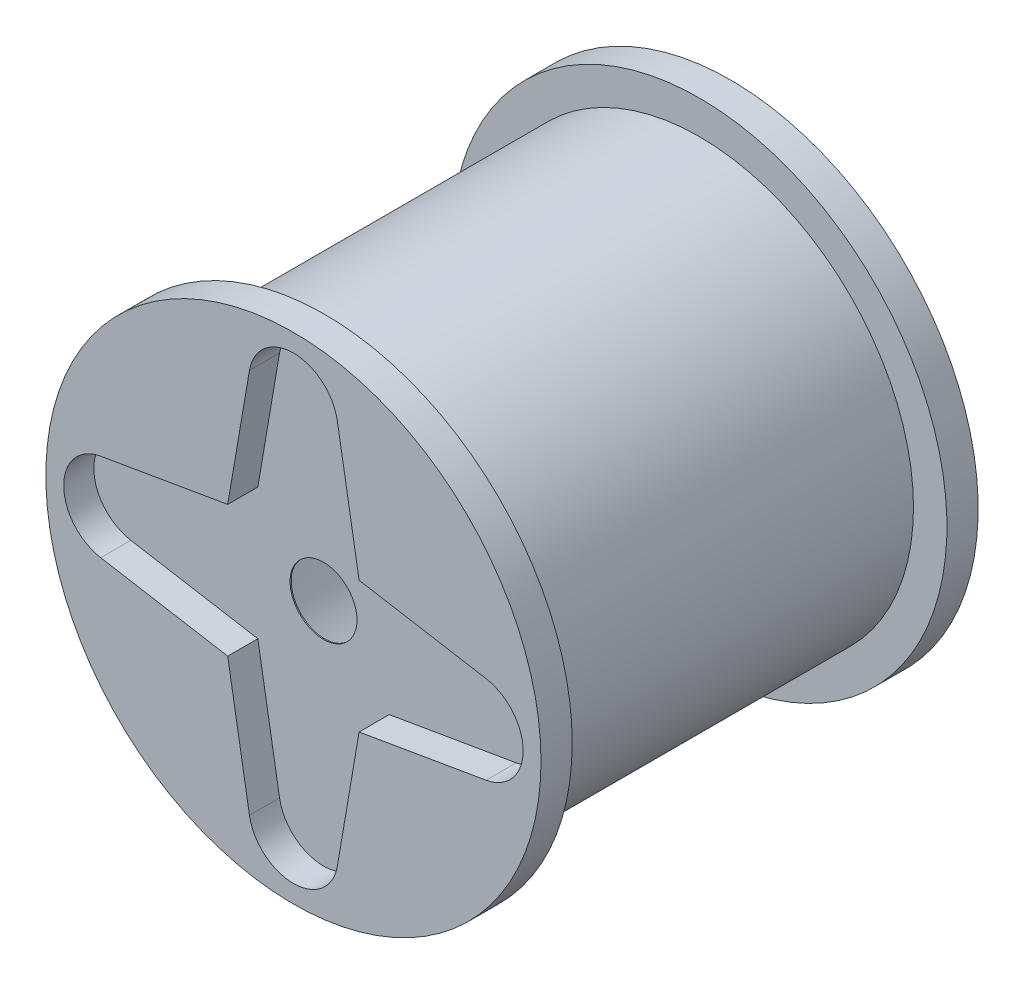
ISO-10303-21;
HEADER;
FILE_DESCRIPTION(('STEP AP214'),'2;1');
FILE_NAME('part.step','',(''),(''),'','','');
FILE_SCHEMA(('AUTOMOTIVE_DESIGN { 1 0 10303 214 1 1 1 1 }'));
ENDSEC;
DATA;
#1=APPLICATION_CONTEXT('core data for automotive mechanical design processes');
#2=APPLICATION_PROTOCOL_DEFINITION('international standard','automotive_design',2000,#1);
#3=PRODUCT_CONTEXT('',#1,'mechanical');
#4=PRODUCT('Part','Part','',(#3));
#5=PRODUCT_RELATED_PRODUCT_CATEGORY('part','',(#4));
#6=PRODUCT_DEFINITION_FORMATION('','',#4);
#7=PRODUCT_DEFINITION_CONTEXT('part definition',#1,'design');
#8=PRODUCT_DEFINITION('design','',#6,#7);
#9=PRODUCT_DEFINITION_SHAPE('','',#8);
#10=(LENGTH_UNIT() NAMED_UNIT(*) SI_UNIT(.MILLI.,.METRE.));
#11=(NAMED_UNIT(*) PLANE_ANGLE_UNIT() SI_UNIT($,.RADIAN.));
#12=(NAMED_UNIT(*) SI_UNIT($,.STERADIAN.) SOLID_ANGLE_UNIT());
#13=UNCERTAINTY_MEASURE_WITH_UNIT(LENGTH_MEASURE(1.E-05),#10,'distance_accuracy_value','');
#14=(GEOMETRIC_REPRESENTATION_CONTEXT(3) GLOBAL_UNCERTAINTY_ASSIGNED_CONTEXT((#13)) GLOBAL_UNIT_ASSIGNED_CONTEXT((#10,
#11,#12)) REPRESENTATION_CONTEXT('',''));
#15=CARTESIAN_POINT('',(0.,0.,0.));
#16=DIRECTION('',(0.,0.,1.));
#17=DIRECTION('',(1.,0.,0.));
#18=AXIS2_PLACEMENT_3D('',#15,#16,#17);
#19=CARTESIAN_POINT('',(3.35128403147245,0.573493975903614,8.45));
#20=DIRECTION('',(0.985671773962487,0.168674698795181,0.));
#21=DIRECTION('',(-0.168674698795181,0.985671773962487,0.));
#22=AXIS2_PLACEMENT_3D('',#19,#20,#21);
#23=PLANE('',#22);
#24=DIRECTION('',(0.,0.,-1.));
#25=VECTOR('',#24,1.);
#26=CARTESIAN_POINT('',(2.94538951713309,2.94538951713312,8.45));
#27=LINE('',#26,#25);
#28=CARTESIAN_POINT('',(2.94538951713309,2.94538951713312,9.8));
#29=VERTEX_POINT('',#28);
#30=CARTESIAN_POINT('',(2.94538951713309,2.94538951713312,8.45));
#31=VERTEX_POINT('',#30);
#32=EDGE_CURVE('E213',#29,#31,#27,.T.);
#33=ORIENTED_EDGE('',*,*,#32,.F.);
#34=DIRECTION('',(-0.168674698795181,0.985671773962487,0.));
#35=VECTOR('',#34,1.);
#36=CARTESIAN_POINT('',(3.35128403147245,0.573493975903614,9.8));
#37=LINE('',#36,#35);
#38=CARTESIAN_POINT('',(1.97134354792497,8.63734939759036,9.8));
#39=VERTEX_POINT('',#38);
#40=EDGE_CURVE('E50',#29,#39,#37,.T.);
#41=ORIENTED_EDGE('',*,*,#40,.T.);
#42=DIRECTION('',(0.,0.,1.));
#43=VECTOR('',#42,1.);
#44=CARTESIAN_POINT('',(1.97134354792497,8.63734939759036,8.45));
#45=LINE('',#44,#43);
#46=CARTESIAN_POINT('',(1.97134354792497,8.63734939759036,8.45));
#47=VERTEX_POINT('',#46);
#48=EDGE_CURVE('E225',#47,#39,#45,.T.);
#49=ORIENTED_EDGE('',*,*,#48,.F.);
#50=DIRECTION('',(-0.168674698795181,0.985671773962487,0.));
#51=VECTOR('',#50,1.);
#52=CARTESIAN_POINT('',(3.35128403147245,0.573493975903614,8.45));
#53=LINE('',#52,#51);
#54=EDGE_CURVE('E219',#31,#47,#53,.T.);
#55=ORIENTED_EDGE('',*,*,#54,.F.);
#56=EDGE_LOOP('',(#33,#41,#49,#55));
#57=FACE_BOUND('',#56,.T.);
#58=ADVANCED_FACE('F33',(#57),#23,.F.);
#59=CARTESIAN_POINT('',(0.,0.,-9.8));
#60=DIRECTION('',(0.,0.,1.));
#61=DIRECTION('',(1.,0.,0.));
#62=AXIS2_PLACEMENT_3D('',#59,#60,#61);
#63=CYLINDRICAL_SURFACE('',#62,9.6);
#64=CARTESIAN_POINT('',(0.,0.,8.4));
#65=DIRECTION('',(0.,0.,1.));
#66=DIRECTION('',(1.,0.,0.));
#67=AXIS2_PLACEMENT_3D('',#64,#65,#66);
#68=CIRCLE('',#67,9.6);
#69=CARTESIAN_POINT('',(9.6,0.,8.4));
#70=VERTEX_POINT('',#69);
#71=EDGE_CURVE('E11',#70,#70,#68,.F.);
#72=ORIENTED_EDGE('',*,*,#71,.T.);
#73=EDGE_LOOP('',(#72));
#74=FACE_BOUND('',#73,.T.);
#75=CARTESIAN_POINT('',(0.,0.,-8.4));
#76=DIRECTION('',(0.,0.,-1.));
#77=DIRECTION('',(-1.,0.,0.));
#78=AXIS2_PLACEMENT_3D('',#75,#76,#77);
#79=CIRCLE('',#78,9.6);
#80=CARTESIAN_POINT('',(-9.6,0.,-8.4));
#81=VERTEX_POINT('',#80);
#82=EDGE_CURVE('E238',#81,#81,#79,.F.);
#83=ORIENTED_EDGE('',*,*,#82,.T.);
#84=EDGE_LOOP('',(#83));
#85=FACE_BOUND('',#84,.T.);
#86=ADVANCED_FACE('F35',(#74,#85),#63,.T.);
#87=CARTESIAN_POINT('',(0.,0.,8.4));
#88=DIRECTION('',(0.,0.,1.));
#89=DIRECTION('',(1.,0.,0.));
#90=AXIS2_PLACEMENT_3D('',#87,#88,#89);
#91=CYLINDRICAL_SURFACE('',#90,11.1);
#92=CARTESIAN_POINT('',(0.,0.,8.4));
#93=DIRECTION('',(0.,0.,1.));
#94=DIRECTION('',(1.,0.,0.));
#95=AXIS2_PLACEMENT_3D('',#92,#93,#94);
#96=CIRCLE('',#95,11.1);
#97=CARTESIAN_POINT('',(11.1,0.,8.4));
#98=VERTEX_POINT('',#97);
#99=EDGE_CURVE('E42',#98,#98,#96,.T.);
#100=ORIENTED_EDGE('',*,*,#99,.T.);
#101=EDGE_LOOP('',(#100));
#102=FACE_BOUND('',#101,.T.);
#103=CARTESIAN_POINT('',(0.,0.,9.8));
#104=DIRECTION('',(0.,0.,1.));
#105=DIRECTION('',(1.,0.,0.));
#106=AXIS2_PLACEMENT_3D('',#103,#104,#105);
#107=CIRCLE('',#106,11.1);
#108=CARTESIAN_POINT('',(11.1,0.,9.8));
#109=VERTEX_POINT('',#108);
#110=EDGE_CURVE('E243',#109,#109,#107,.T.);
#111=ORIENTED_EDGE('',*,*,#110,.F.);
#112=EDGE_LOOP('',(#111));
#113=FACE_BOUND('',#112,.T.);
#114=ADVANCED_FACE('F278',(#102,#113),#91,.T.);
#115=CARTESIAN_POINT('',(0.,0.,8.4));
#116=DIRECTION('',(0.,0.,1.));
#117=DIRECTION('',(1.,0.,0.));
#118=AXIS2_PLACEMENT_3D('',#115,#116,#117);
#119=PLANE('',#118);
#120=ORIENTED_EDGE('',*,*,#71,.F.);
#121=EDGE_LOOP('',(#120));
#122=FACE_BOUND('',#121,.T.);
#123=ORIENTED_EDGE('',*,*,#99,.F.);
#124=EDGE_LOOP('',(#123));
#125=FACE_BOUND('',#124,.T.);
#126=ADVANCED_FACE('F282',(#122,#125),#119,.F.);
#127=CARTESIAN_POINT('',(0.,0.,9.8));
#128=DIRECTION('',(0.,0.,1.));
#129=DIRECTION('',(1.,0.,0.));
#130=AXIS2_PLACEMENT_3D('',#127,#128,#129);
#131=PLANE('',#130);
#132=DIRECTION('',(-0.985671773962486,-0.168674698795184,0.));
#133=VECTOR('',#132,1.);
#134=CARTESIAN_POINT('',(-0.573493975903626,3.35128403147245,9.8));
#135=LINE('',#134,#133);
#136=CARTESIAN_POINT('',(-2.9453895171331,2.94538951713309,9.8));
#137=VERTEX_POINT('',#136);
#138=CARTESIAN_POINT('',(-8.63734939759037,1.97134354792494,9.8));
#139=VERTEX_POINT('',#138);
#140=EDGE_CURVE('E196',#137,#139,#135,.T.);
#141=ORIENTED_EDGE('',*,*,#140,.F.);
#142=DIRECTION('',(0.168674698795181,0.985671773962487,0.));
#143=VECTOR('',#142,1.);
#144=CARTESIAN_POINT('',(-3.35128403147245,0.573493975903614,9.8));
#145=LINE('',#144,#143);
#146=CARTESIAN_POINT('',(-1.97134354792497,8.63734939759036,9.8));
#147=VERTEX_POINT('',#146);
#148=EDGE_CURVE('E71',#137,#147,#145,.T.);
#149=ORIENTED_EDGE('',*,*,#148,.T.);
#150=CARTESIAN_POINT('',(0.,8.3,9.8));
#151=DIRECTION('',(0.,0.,1.));
#152=DIRECTION('',(1.,0.,0.));
#153=AXIS2_PLACEMENT_3D('',#150,#151,#152);
#154=CIRCLE('',#153,2.);
#155=EDGE_CURVE('E227',#39,#147,#154,.T.);
#156=ORIENTED_EDGE('',*,*,#155,.F.);
#157=ORIENTED_EDGE('',*,*,#40,.F.);
#158=DIRECTION('',(0.985671773962488,-0.16867469879517,0.));
#159=VECTOR('',#158,1.);
#160=CARTESIAN_POINT('',(0.573493975903579,3.35128403147246,9.8));
#161=LINE('',#160,#159);
#162=CARTESIAN_POINT('',(8.63734939759034,1.97134354792506,9.8));
#163=VERTEX_POINT('',#162);
#164=EDGE_CURVE('E147',#29,#163,#161,.T.);
#165=ORIENTED_EDGE('',*,*,#164,.T.);
#166=CARTESIAN_POINT('',(8.3,0.,9.8));
#167=DIRECTION('',(0.,0.,1.));
#168=DIRECTION('',(0.,-1.,0.));
#169=AXIS2_PLACEMENT_3D('',#166,#167,#168);
#170=CIRCLE('',#169,2.);
#171=CARTESIAN_POINT('',(8.63734939759038,-1.97134354792488,9.8));
#172=VERTEX_POINT('',#171);
#173=EDGE_CURVE('E167',#172,#163,#170,.T.);
#174=ORIENTED_EDGE('',*,*,#173,.F.);
#175=DIRECTION('',(0.985671773962485,0.168674698795191,0.));
#176=VECTOR('',#175,1.);
#177=CARTESIAN_POINT('',(0.573493975903649,-3.35128403147245,9.8));
#178=LINE('',#177,#176);
#179=CARTESIAN_POINT('',(2.9453895171331,-2.94538951713307,9.8));
#180=VERTEX_POINT('',#179);
#181=EDGE_CURVE('E153',#180,#172,#178,.T.);
#182=ORIENTED_EDGE('',*,*,#181,.F.);
#183=DIRECTION('',(-0.168674698795181,-0.985671773962487,0.));
#184=VECTOR('',#183,1.);
#185=CARTESIAN_POINT('',(3.35128403147245,-0.573493975903614,9.8));
#186=LINE('',#185,#184);
#187=CARTESIAN_POINT('',(1.97134354792497,-8.63734939759036,9.8));
#188=VERTEX_POINT('',#187);
#189=EDGE_CURVE('E179',#180,#188,#186,.T.);
#190=ORIENTED_EDGE('',*,*,#189,.T.);
#191=CARTESIAN_POINT('',(0.,-8.3,9.8));
#192=DIRECTION('',(0.,0.,1.));
#193=DIRECTION('',(-1.,0.,0.));
#194=AXIS2_PLACEMENT_3D('',#191,#192,#193);
#195=CIRCLE('',#194,2.);
#196=CARTESIAN_POINT('',(-1.97134354792497,-8.63734939759036,9.8));
#197=VERTEX_POINT('',#196);
#198=EDGE_CURVE('E184',#197,#188,#195,.T.);
#199=ORIENTED_EDGE('',*,*,#198,.F.);
#200=DIRECTION('',(0.168674698795181,-0.985671773962487,0.));
#201=VECTOR('',#200,1.);
#202=CARTESIAN_POINT('',(-3.35128403147245,-0.573493975903614,9.8));
#203=LINE('',#202,#201);
#204=CARTESIAN_POINT('',(-2.9453895171331,-2.94538951713311,9.8));
#205=VERTEX_POINT('',#204);
#206=EDGE_CURVE('E175',#205,#197,#203,.T.);
#207=ORIENTED_EDGE('',*,*,#206,.F.);
#208=DIRECTION('',(-0.985671773962487,0.168674698795177,0.));
#209=VECTOR('',#208,1.);
#210=CARTESIAN_POINT('',(-0.573493975903602,-3.35128403147246,9.8));
#211=LINE('',#210,#209);
#212=CARTESIAN_POINT('',(-8.63734939759035,-1.971343547925,9.8));
#213=VERTEX_POINT('',#212);
#214=EDGE_CURVE('E199',#205,#213,#211,.T.);
#215=ORIENTED_EDGE('',*,*,#214,.T.);
#216=CARTESIAN_POINT('',(-8.3,0.,9.8));
#217=DIRECTION('',(0.,0.,1.));
#218=DIRECTION('',(0.,1.,0.));
#219=AXIS2_PLACEMENT_3D('',#216,#217,#218);
#220=CIRCLE('',#219,2.);
#221=EDGE_CURVE('E206',#139,#213,#220,.T.);
#222=ORIENTED_EDGE('',*,*,#221,.F.);
#223=EDGE_LOOP('',(#141,#149,#156,#157,#165,#174,#182,#190,#199,#207,#215,#222));
#224=FACE_BOUND('',#223,.T.);
#225=ORIENTED_EDGE('',*,*,#110,.T.);
#226=EDGE_LOOP('',(#225));
#227=FACE_BOUND('',#226,.T.);
#228=ADVANCED_FACE('F259',(#224,#227),#131,.T.);
#229=CARTESIAN_POINT('',(0.,0.,-8.4));
#230=DIRECTION('',(0.,0.,-1.));
#231=DIRECTION('',(-1.,0.,0.));
#232=AXIS2_PLACEMENT_3D('',#229,#230,#231);
#233=CYLINDRICAL_SURFACE('',#232,11.1);
#234=CARTESIAN_POINT('',(0.,0.,-8.4));
#235=DIRECTION('',(0.,0.,-1.));
#236=DIRECTION('',(-1.,0.,0.));
#237=AXIS2_PLACEMENT_3D('',#234,#235,#236);
#238=CIRCLE('',#237,11.1);
#239=CARTESIAN_POINT('',(-11.1,0.,-8.4));
#240=VERTEX_POINT('',#239);
#241=EDGE_CURVE('E235',#240,#240,#238,.T.);
#242=ORIENTED_EDGE('',*,*,#241,.T.);
#243=EDGE_LOOP('',(#242));
#244=FACE_BOUND('',#243,.T.);
#245=CARTESIAN_POINT('',(0.,0.,-9.8));
#246=DIRECTION('',(0.,0.,-1.));
#247=DIRECTION('',(-1.,0.,0.));
#248=AXIS2_PLACEMENT_3D('',#245,#246,#247);
#249=CIRCLE('',#248,11.1);
#250=CARTESIAN_POINT('',(-11.1,0.,-9.8));
#251=VERTEX_POINT('',#250);
#252=EDGE_CURVE('E233',#251,#251,#249,.T.);
#253=ORIENTED_EDGE('',*,*,#252,.F.);
#254=EDGE_LOOP('',(#253));
#255=FACE_BOUND('',#254,.T.);
#256=ADVANCED_FACE('F253',(#244,#255),#233,.T.);
#257=CARTESIAN_POINT('',(0.,0.,-8.4));
#258=DIRECTION('',(0.,0.,-1.));
#259=DIRECTION('',(-1.,0.,0.));
#260=AXIS2_PLACEMENT_3D('',#257,#258,#259);
#261=PLANE('',#260);
#262=ORIENTED_EDGE('',*,*,#82,.F.);
#263=EDGE_LOOP('',(#262));
#264=FACE_BOUND('',#263,.T.);
#265=ORIENTED_EDGE('',*,*,#241,.F.);
#266=EDGE_LOOP('',(#265));
#267=FACE_BOUND('',#266,.T.);
#268=ADVANCED_FACE('F249',(#264,#267),#261,.F.);
#269=CARTESIAN_POINT('',(0.,0.,-9.8));
#270=DIRECTION('',(0.,0.,1.));
#271=DIRECTION('',(1.,0.,0.));
#272=AXIS2_PLACEMENT_3D('',#269,#270,#271);
#273=PLANE('',#272);
#274=CARTESIAN_POINT('',(0.,0.,-9.8));
#275=DIRECTION('',(0.,0.,-1.));
#276=DIRECTION('',(-1.,0.,0.));
#277=AXIS2_PLACEMENT_3D('',#274,#275,#276);
#278=CIRCLE('',#277,8.);
#279=CARTESIAN_POINT('',(-8.,0.,-9.8));
#280=VERTEX_POINT('',#279);
#281=EDGE_CURVE('E168',#280,#280,#278,.T.);
#282=ORIENTED_EDGE('',*,*,#281,.F.);
#283=EDGE_LOOP('',(#282));
#284=FACE_BOUND('',#283,.T.);
#285=ORIENTED_EDGE('',*,*,#252,.T.);
#286=EDGE_LOOP('',(#285));
#287=FACE_BOUND('',#286,.T.);
#288=ADVANCED_FACE('F252',(#284,#287),#273,.F.);
#289=CARTESIAN_POINT('',(-3.35128403147245,0.573493975903614,8.45));
#290=DIRECTION('',(0.985671773962487,-0.168674698795181,0.));
#291=DIRECTION('',(0.168674698795181,0.985671773962487,0.));
#292=AXIS2_PLACEMENT_3D('',#289,#290,#291);
#293=PLANE('',#292);
#294=DIRECTION('',(0.,0.,1.));
#295=VECTOR('',#294,1.);
#296=CARTESIAN_POINT('',(-2.9453895171331,2.94538951713309,8.45));
#297=LINE('',#296,#295);
#298=CARTESIAN_POINT('',(-2.9453895171331,2.94538951713309,8.45));
#299=VERTEX_POINT('',#298);
#300=EDGE_CURVE('E217',#299,#137,#297,.T.);
#301=ORIENTED_EDGE('',*,*,#300,.F.);
#302=DIRECTION('',(0.168674698795181,0.985671773962487,0.));
#303=VECTOR('',#302,1.);
#304=CARTESIAN_POINT('',(-3.35128403147245,0.573493975903614,8.45));
#305=LINE('',#304,#303);
#306=CARTESIAN_POINT('',(-1.97134354792497,8.63734939759036,8.45));
#307=VERTEX_POINT('',#306);
#308=EDGE_CURVE('E59',#299,#307,#305,.T.);
#309=ORIENTED_EDGE('',*,*,#308,.T.);
#310=DIRECTION('',(0.,0.,1.));
#311=VECTOR('',#310,1.);
#312=CARTESIAN_POINT('',(-1.97134354792497,8.63734939759036,8.45));
#313=LINE('',#312,#311);
#314=EDGE_CURVE('E231',#307,#147,#313,.T.);
#315=ORIENTED_EDGE('',*,*,#314,.T.);
#316=ORIENTED_EDGE('',*,*,#148,.F.);
#317=EDGE_LOOP('',(#301,#309,#315,#316));
#318=FACE_BOUND('',#317,.T.);
#319=ADVANCED_FACE('F264',(#318),#293,.T.);
#320=CARTESIAN_POINT('',(0.,8.3,8.45));
#321=DIRECTION('',(0.,0.,1.));
#322=DIRECTION('',(1.,0.,0.));
#323=AXIS2_PLACEMENT_3D('',#320,#321,#322);
#324=CYLINDRICAL_SURFACE('',#323,2.);
#325=ORIENTED_EDGE('',*,*,#155,.T.);
#326=ORIENTED_EDGE('',*,*,#314,.F.);
#327=CARTESIAN_POINT('',(0.,8.3,8.45));
#328=DIRECTION('',(0.,0.,1.));
#329=DIRECTION('',(1.,0.,0.));
#330=AXIS2_PLACEMENT_3D('',#327,#328,#329);
#331=CIRCLE('',#330,2.);
#332=EDGE_CURVE('E221',#47,#307,#331,.T.);
#333=ORIENTED_EDGE('',*,*,#332,.F.);
#334=ORIENTED_EDGE('',*,*,#48,.T.);
#335=EDGE_LOOP('',(#325,#326,#333,#334));
#336=FACE_BOUND('',#335,.T.);
#337=ADVANCED_FACE('F269',(#336),#324,.F.);
#338=CARTESIAN_POINT('',(0.,0.,8.45));
#339=DIRECTION('',(0.,0.,1.));
#340=DIRECTION('',(1.,0.,0.));
#341=AXIS2_PLACEMENT_3D('',#338,#339,#340);
#342=PLANE('',#341);
#343=CARTESIAN_POINT('',(0.,0.,8.45));
#344=DIRECTION('',(0.,0.,1.));
#345=DIRECTION('',(1.,0.,0.));
#346=AXIS2_PLACEMENT_3D('',#343,#344,#345);
#347=CIRCLE('',#346,1.5);
#348=CARTESIAN_POINT('',(1.5,0.,8.45));
#349=VERTEX_POINT('',#348);
#350=EDGE_CURVE('E346',#349,#349,#347,.T.);
#351=ORIENTED_EDGE('',*,*,#350,.F.);
#352=EDGE_LOOP('',(#351));
#353=FACE_BOUND('',#352,.T.);
#354=DIRECTION('',(0.985671773962488,-0.16867469879517,0.));
#355=VECTOR('',#354,1.);
#356=CARTESIAN_POINT('',(0.573493975903579,3.35128403147246,8.45));
#357=LINE('',#356,#355);
#358=CARTESIAN_POINT('',(8.63734939759034,1.97134354792506,8.45));
#359=VERTEX_POINT('',#358);
#360=EDGE_CURVE('E158',#31,#359,#357,.T.);
#361=ORIENTED_EDGE('',*,*,#360,.F.);
#362=ORIENTED_EDGE('',*,*,#54,.T.);
#363=ORIENTED_EDGE('',*,*,#332,.T.);
#364=ORIENTED_EDGE('',*,*,#308,.F.);
#365=DIRECTION('',(-0.985671773962486,-0.168674698795184,0.));
#366=VECTOR('',#365,1.);
#367=CARTESIAN_POINT('',(-0.573493975903626,3.35128403147245,8.45));
#368=LINE('',#367,#366);
#369=CARTESIAN_POINT('',(-8.63734939759037,1.97134354792494,8.45));
#370=VERTEX_POINT('',#369);
#371=EDGE_CURVE('E78',#299,#370,#368,.T.);
#372=ORIENTED_EDGE('',*,*,#371,.T.);
#373=CARTESIAN_POINT('',(-8.3,0.,8.45));
#374=DIRECTION('',(0.,0.,1.));
#375=DIRECTION('',(0.,1.,0.));
#376=AXIS2_PLACEMENT_3D('',#373,#374,#375);
#377=CIRCLE('',#376,2.);
#378=CARTESIAN_POINT('',(-8.63734939759035,-1.971343547925,8.45));
#379=VERTEX_POINT('',#378);
#380=EDGE_CURVE('E198',#370,#379,#377,.T.);
#381=ORIENTED_EDGE('',*,*,#380,.T.);
#382=DIRECTION('',(-0.985671773962487,0.168674698795177,0.));
#383=VECTOR('',#382,1.);
#384=CARTESIAN_POINT('',(-0.573493975903602,-3.35128403147246,8.45));
#385=LINE('',#384,#383);
#386=CARTESIAN_POINT('',(-2.9453895171331,-2.94538951713311,8.45));
#387=VERTEX_POINT('',#386);
#388=EDGE_CURVE('E202',#387,#379,#385,.T.);
#389=ORIENTED_EDGE('',*,*,#388,.F.);
#390=DIRECTION('',(0.168674698795181,-0.985671773962487,0.));
#391=VECTOR('',#390,1.);
#392=CARTESIAN_POINT('',(-3.35128403147245,-0.573493975903614,8.45));
#393=LINE('',#392,#391);
#394=CARTESIAN_POINT('',(-1.97134354792497,-8.63734939759036,8.45));
#395=VERTEX_POINT('',#394);
#396=EDGE_CURVE('E176',#387,#395,#393,.T.);
#397=ORIENTED_EDGE('',*,*,#396,.T.);
#398=CARTESIAN_POINT('',(0.,-8.3,8.45));
#399=DIRECTION('',(0.,0.,1.));
#400=DIRECTION('',(-1.,0.,0.));
#401=AXIS2_PLACEMENT_3D('',#398,#399,#400);
#402=CIRCLE('',#401,2.);
#403=CARTESIAN_POINT('',(1.97134354792497,-8.63734939759036,8.45));
#404=VERTEX_POINT('',#403);
#405=EDGE_CURVE('E178',#395,#404,#402,.T.);
#406=ORIENTED_EDGE('',*,*,#405,.T.);
#407=DIRECTION('',(-0.168674698795181,-0.985671773962487,0.));
#408=VECTOR('',#407,1.);
#409=CARTESIAN_POINT('',(3.35128403147245,-0.573493975903614,8.45));
#410=LINE('',#409,#408);
#411=CARTESIAN_POINT('',(2.9453895171331,-2.94538951713307,8.45));
#412=VERTEX_POINT('',#411);
#413=EDGE_CURVE('E143',#412,#404,#410,.T.);
#414=ORIENTED_EDGE('',*,*,#413,.F.);
#415=DIRECTION('',(0.985671773962485,0.168674698795191,0.));
#416=VECTOR('',#415,1.);
#417=CARTESIAN_POINT('',(0.573493975903649,-3.35128403147245,8.45));
#418=LINE('',#417,#416);
#419=CARTESIAN_POINT('',(8.63734939759038,-1.97134354792488,8.45));
#420=VERTEX_POINT('',#419);
#421=EDGE_CURVE('E136',#412,#420,#418,.T.);
#422=ORIENTED_EDGE('',*,*,#421,.T.);
#423=CARTESIAN_POINT('',(8.3,0.,8.45));
#424=DIRECTION('',(0.,0.,1.));
#425=DIRECTION('',(0.,-1.,0.));
#426=AXIS2_PLACEMENT_3D('',#423,#424,#425);
#427=CIRCLE('',#426,2.);
#428=EDGE_CURVE('E141',#420,#359,#427,.T.);
#429=ORIENTED_EDGE('',*,*,#428,.T.);
#430=EDGE_LOOP('',(#361,#362,#363,#364,#372,#381,#389,#397,#406,#414,#422,#429));
#431=FACE_BOUND('',#430,.T.);
#432=ADVANCED_FACE('F139',(#353,#431),#342,.T.);
#433=CARTESIAN_POINT('',(0.573493975903579,3.35128403147246,8.45));
#434=DIRECTION('',(-0.16867469879517,-0.985671773962488,0.));
#435=DIRECTION('',(0.985671773962488,-0.16867469879517,0.));
#436=AXIS2_PLACEMENT_3D('',#433,#434,#435);
#437=PLANE('',#436);
#438=ORIENTED_EDGE('',*,*,#32,.T.);
#439=ORIENTED_EDGE('',*,*,#360,.T.);
#440=DIRECTION('',(0.,0.,1.));
#441=VECTOR('',#440,1.);
#442=CARTESIAN_POINT('',(8.63734939759034,1.97134354792506,8.45));
#443=LINE('',#442,#441);
#444=EDGE_CURVE('E157',#359,#163,#443,.T.);
#445=ORIENTED_EDGE('',*,*,#444,.T.);
#446=ORIENTED_EDGE('',*,*,#164,.F.);
#447=EDGE_LOOP('',(#438,#439,#445,#446));
#448=FACE_BOUND('',#447,.T.);
#449=ADVANCED_FACE('F298',(#448),#437,.T.);
#450=CARTESIAN_POINT('',(-0.573493975903626,3.35128403147245,8.45));
#451=DIRECTION('',(-0.168674698795184,0.985671773962486,0.));
#452=DIRECTION('',(-0.985671773962486,-0.168674698795184,0.));
#453=AXIS2_PLACEMENT_3D('',#450,#451,#452);
#454=PLANE('',#453);
#455=ORIENTED_EDGE('',*,*,#300,.T.);
#456=ORIENTED_EDGE('',*,*,#140,.T.);
#457=DIRECTION('',(0.,0.,1.));
#458=VECTOR('',#457,1.);
#459=CARTESIAN_POINT('',(-8.63734939759037,1.97134354792494,8.45));
#460=LINE('',#459,#458);
#461=EDGE_CURVE('E204',#370,#139,#460,.T.);
#462=ORIENTED_EDGE('',*,*,#461,.F.);
#463=ORIENTED_EDGE('',*,*,#371,.F.);
#464=EDGE_LOOP('',(#455,#456,#462,#463));
#465=FACE_BOUND('',#464,.T.);
#466=ADVANCED_FACE('F301',(#465),#454,.F.);
#467=CARTESIAN_POINT('',(-0.573493975903602,-3.35128403147246,8.45));
#468=DIRECTION('',(0.168674698795177,0.985671773962487,0.));
#469=DIRECTION('',(-0.985671773962487,0.168674698795177,0.));
#470=AXIS2_PLACEMENT_3D('',#467,#468,#469);
#471=PLANE('',#470);
#472=ORIENTED_EDGE('',*,*,#388,.T.);
#473=DIRECTION('',(0.,0.,1.));
#474=VECTOR('',#473,1.);
#475=CARTESIAN_POINT('',(-8.63734939759035,-1.971343547925,8.45));
#476=LINE('',#475,#474);
#477=EDGE_CURVE('E211',#379,#213,#476,.T.);
#478=ORIENTED_EDGE('',*,*,#477,.T.);
#479=ORIENTED_EDGE('',*,*,#214,.F.);
#480=DIRECTION('',(0.,0.,1.));
#481=VECTOR('',#480,1.);
#482=CARTESIAN_POINT('',(-2.9453895171331,-2.94538951713311,8.45));
#483=LINE('',#482,#481);
#484=EDGE_CURVE('E191',#387,#205,#483,.T.);
#485=ORIENTED_EDGE('',*,*,#484,.F.);
#486=EDGE_LOOP('',(#472,#478,#479,#485));
#487=FACE_BOUND('',#486,.T.);
#488=ADVANCED_FACE('F306',(#487),#471,.T.);
#489=CARTESIAN_POINT('',(-8.3,0.,8.45));
#490=DIRECTION('',(0.,0.,1.));
#491=DIRECTION('',(1.,0.,0.));
#492=AXIS2_PLACEMENT_3D('',#489,#490,#491);
#493=CYLINDRICAL_SURFACE('',#492,2.);
#494=ORIENTED_EDGE('',*,*,#221,.T.);
#495=ORIENTED_EDGE('',*,*,#477,.F.);
#496=ORIENTED_EDGE('',*,*,#380,.F.);
#497=ORIENTED_EDGE('',*,*,#461,.T.);
#498=EDGE_LOOP('',(#494,#495,#496,#497));
#499=FACE_BOUND('',#498,.T.);
#500=ADVANCED_FACE('F304',(#499),#493,.F.);
#501=CARTESIAN_POINT('',(-3.35128403147245,-0.573493975903614,8.45));
#502=DIRECTION('',(-0.985671773962487,-0.168674698795181,0.));
#503=DIRECTION('',(0.168674698795181,-0.985671773962487,0.));
#504=AXIS2_PLACEMENT_3D('',#501,#502,#503);
#505=PLANE('',#504);
#506=ORIENTED_EDGE('',*,*,#484,.T.);
#507=ORIENTED_EDGE('',*,*,#206,.T.);
#508=DIRECTION('',(0.,0.,1.));
#509=VECTOR('',#508,1.);
#510=CARTESIAN_POINT('',(-1.97134354792497,-8.63734939759036,8.45));
#511=LINE('',#510,#509);
#512=EDGE_CURVE('E182',#395,#197,#511,.T.);
#513=ORIENTED_EDGE('',*,*,#512,.F.);
#514=ORIENTED_EDGE('',*,*,#396,.F.);
#515=EDGE_LOOP('',(#506,#507,#513,#514));
#516=FACE_BOUND('',#515,.T.);
#517=ADVANCED_FACE('F312',(#516),#505,.F.);
#518=CARTESIAN_POINT('',(3.35128403147245,-0.573493975903614,8.45));
#519=DIRECTION('',(-0.985671773962487,0.168674698795181,0.));
#520=DIRECTION('',(-0.168674698795181,-0.985671773962487,0.));
#521=AXIS2_PLACEMENT_3D('',#518,#519,#520);
#522=PLANE('',#521);
#523=ORIENTED_EDGE('',*,*,#413,.T.);
#524=DIRECTION('',(0.,0.,1.));
#525=VECTOR('',#524,1.);
#526=CARTESIAN_POINT('',(1.97134354792497,-8.63734939759036,8.45));
#527=LINE('',#526,#525);
#528=EDGE_CURVE('E189',#404,#188,#527,.T.);
#529=ORIENTED_EDGE('',*,*,#528,.T.);
#530=ORIENTED_EDGE('',*,*,#189,.F.);
#531=DIRECTION('',(0.,0.,1.));
#532=VECTOR('',#531,1.);
#533=CARTESIAN_POINT('',(2.9453895171331,-2.94538951713307,8.45));
#534=LINE('',#533,#532);
#535=EDGE_CURVE('E172',#412,#180,#534,.T.);
#536=ORIENTED_EDGE('',*,*,#535,.F.);
#537=EDGE_LOOP('',(#523,#529,#530,#536));
#538=FACE_BOUND('',#537,.T.);
#539=ADVANCED_FACE('F319',(#538),#522,.T.);
#540=CARTESIAN_POINT('',(0.,-8.3,8.45));
#541=DIRECTION('',(0.,0.,1.));
#542=DIRECTION('',(1.,0.,0.));
#543=AXIS2_PLACEMENT_3D('',#540,#541,#542);
#544=CYLINDRICAL_SURFACE('',#543,2.);
#545=ORIENTED_EDGE('',*,*,#198,.T.);
#546=ORIENTED_EDGE('',*,*,#528,.F.);
#547=ORIENTED_EDGE('',*,*,#405,.F.);
#548=ORIENTED_EDGE('',*,*,#512,.T.);
#549=EDGE_LOOP('',(#545,#546,#547,#548));
#550=FACE_BOUND('',#549,.T.);
#551=ADVANCED_FACE('F317',(#550),#544,.F.);
#552=CARTESIAN_POINT('',(0.573493975903649,-3.35128403147245,8.45));
#553=DIRECTION('',(0.168674698795191,-0.985671773962485,0.));
#554=DIRECTION('',(0.985671773962485,0.168674698795191,0.));
#555=AXIS2_PLACEMENT_3D('',#552,#553,#554);
#556=PLANE('',#555);
#557=ORIENTED_EDGE('',*,*,#535,.T.);
#558=ORIENTED_EDGE('',*,*,#181,.T.);
#559=DIRECTION('',(0.,0.,1.));
#560=VECTOR('',#559,1.);
#561=CARTESIAN_POINT('',(8.63734939759038,-1.97134354792488,8.45));
#562=LINE('',#561,#560);
#563=EDGE_CURVE('E150',#420,#172,#562,.T.);
#564=ORIENTED_EDGE('',*,*,#563,.F.);
#565=ORIENTED_EDGE('',*,*,#421,.F.);
#566=EDGE_LOOP('',(#557,#558,#564,#565));
#567=FACE_BOUND('',#566,.T.);
#568=ADVANCED_FACE('F151',(#567),#556,.F.);
#569=CARTESIAN_POINT('',(8.3,0.,8.45));
#570=DIRECTION('',(0.,0.,1.));
#571=DIRECTION('',(1.,0.,0.));
#572=AXIS2_PLACEMENT_3D('',#569,#570,#571);
#573=CYLINDRICAL_SURFACE('',#572,2.);
#574=ORIENTED_EDGE('',*,*,#173,.T.);
#575=ORIENTED_EDGE('',*,*,#444,.F.);
#576=ORIENTED_EDGE('',*,*,#428,.F.);
#577=ORIENTED_EDGE('',*,*,#563,.T.);
#578=EDGE_LOOP('',(#574,#575,#576,#577));
#579=FACE_BOUND('',#578,.T.);
#580=ADVANCED_FACE('F161',(#579),#573,.F.);
#581=CARTESIAN_POINT('',(0.,0.,-9.8));
#582=DIRECTION('',(0.,0.,-1.));
#583=DIRECTION('',(-1.,0.,0.));
#584=AXIS2_PLACEMENT_3D('',#581,#582,#583);
#585=CYLINDRICAL_SURFACE('',#584,8.);
#586=CARTESIAN_POINT('',(0.,0.,-8.4));
#587=DIRECTION('',(0.,0.,-1.));
#588=DIRECTION('',(-1.,0.,0.));
#589=AXIS2_PLACEMENT_3D('',#586,#587,#588);
#590=CIRCLE('',#589,8.);
#591=CARTESIAN_POINT('',(-8.,0.,-8.4));
#592=VERTEX_POINT('',#591);
#593=EDGE_CURVE('E354',#592,#592,#590,.T.);
#594=ORIENTED_EDGE('',*,*,#593,.F.);
#595=EDGE_LOOP('',(#594));
#596=FACE_BOUND('',#595,.T.);
#597=ORIENTED_EDGE('',*,*,#281,.T.);
#598=EDGE_LOOP('',(#597));
#599=FACE_BOUND('',#598,.T.);
#600=ADVANCED_FACE('F358',(#596,#599),#585,.F.);
#601=CARTESIAN_POINT('',(0.,0.,-8.4));
#602=DIRECTION('',(0.,0.,-1.));
#603=DIRECTION('',(-1.,0.,0.));
#604=AXIS2_PLACEMENT_3D('',#601,#602,#603);
#605=CONICAL_SURFACE('',#604,8.,0.261713502401205);
#606=CARTESIAN_POINT('',(0.,0.,8.4));
#607=DIRECTION('',(0.,0.,-1.));
#608=DIRECTION('',(-1.,0.,0.));
#609=AXIS2_PLACEMENT_3D('',#606,#607,#608);
#610=CIRCLE('',#609,3.5);
#611=CARTESIAN_POINT('',(-3.5,0.,8.4));
#612=VERTEX_POINT('',#611);
#613=EDGE_CURVE('E350',#612,#612,#610,.T.);
#614=ORIENTED_EDGE('',*,*,#613,.F.);
#615=EDGE_LOOP('',(#614));
#616=FACE_BOUND('',#615,.T.);
#617=ORIENTED_EDGE('',*,*,#593,.T.);
#618=EDGE_LOOP('',(#617));
#619=FACE_BOUND('',#618,.T.);
#620=ADVANCED_FACE('F360',(#616,#619),#605,.F.);
#621=CARTESIAN_POINT('',(0.,3.5,8.4));
#622=DIRECTION('',(0.,0.,1.));
#623=DIRECTION('',(1.,0.,0.));
#624=AXIS2_PLACEMENT_3D('',#621,#622,#623);
#625=PLANE('',#624);
#626=CARTESIAN_POINT('',(0.,0.,8.4));
#627=DIRECTION('',(0.,0.,1.));
#628=DIRECTION('',(1.,0.,0.));
#629=AXIS2_PLACEMENT_3D('',#626,#627,#628);
#630=CIRCLE('',#629,1.5);
#631=CARTESIAN_POINT('',(1.5,0.,8.4));
#632=VERTEX_POINT('',#631);
#633=EDGE_CURVE('E37',#632,#632,#630,.T.);
#634=ORIENTED_EDGE('',*,*,#633,.T.);
#635=EDGE_LOOP('',(#634));
#636=FACE_BOUND('',#635,.T.);
#637=ORIENTED_EDGE('',*,*,#613,.T.);
#638=EDGE_LOOP('',(#637));
#639=FACE_BOUND('',#638,.T.);
#640=ADVANCED_FACE('F367',(#636,#639),#625,.F.);
#641=CARTESIAN_POINT('',(0.,0.,7.25));
#642=DIRECTION('',(0.,0.,1.));
#643=DIRECTION('',(1.,0.,0.));
#644=AXIS2_PLACEMENT_3D('',#641,#642,#643);
#645=CYLINDRICAL_SURFACE('',#644,1.5);
#646=ORIENTED_EDGE('',*,*,#350,.T.);
#647=EDGE_LOOP('',(#646));
#648=FACE_BOUND('',#647,.T.);
#649=ORIENTED_EDGE('',*,*,#633,.F.);
#650=EDGE_LOOP('',(#649));
#651=FACE_BOUND('',#650,.T.);
#652=ADVANCED_FACE('F374',(#648,#651),#645,.F.);
#653=CLOSED_SHELL('',(#58,#86,#114,#126,#228,#256,#268,#288,#319,#337,#432,#449,#466,#488,#500,
#517,#539,#551,#568,#580,#600,#620,#640,#652));
#654=MANIFOLD_SOLID_BREP('B2',#653);
#655=ADVANCED_BREP_SHAPE_REPRESENTATION('',(#18,#654),#14);
#656=SHAPE_DEFINITION_REPRESENTATION(#9,#655);
ENDSEC;
END-ISO-10303-21;
